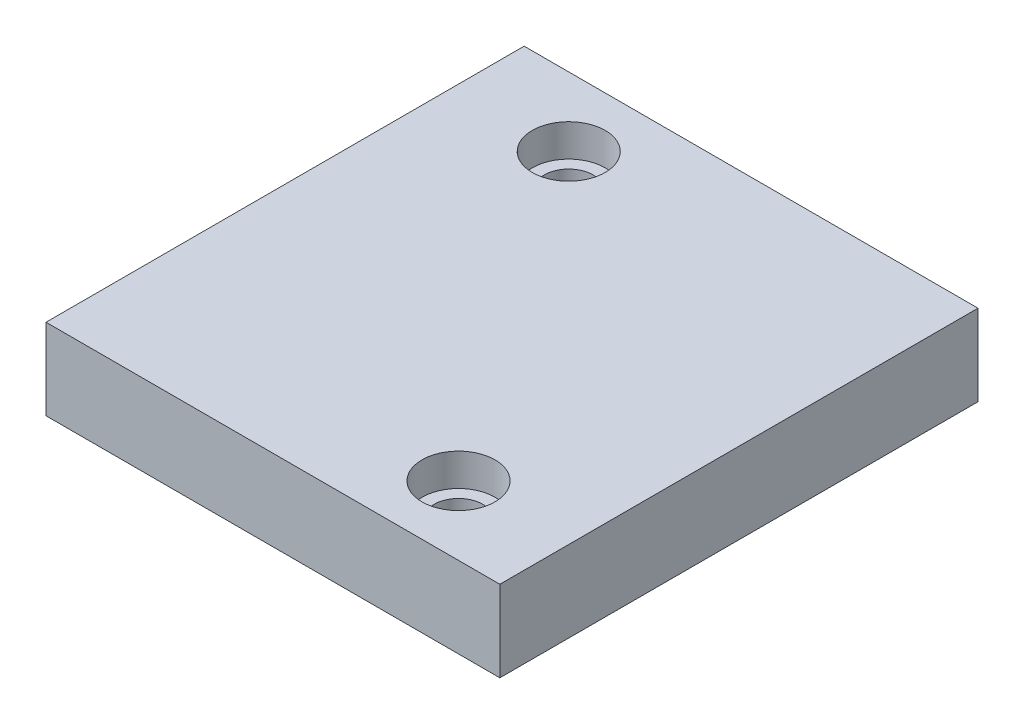
ISO-10303-21;
HEADER;
FILE_DESCRIPTION(('STEP AP214'),'2;1');
FILE_NAME('part.step','',(''),(''),'','','');
FILE_SCHEMA(('AUTOMOTIVE_DESIGN { 1 0 10303 214 1 1 1 1 }'));
ENDSEC;
DATA;
#1=APPLICATION_CONTEXT('core data for automotive mechanical design processes');
#2=APPLICATION_PROTOCOL_DEFINITION('international standard','automotive_design',2000,#1);
#3=PRODUCT_CONTEXT('',#1,'mechanical');
#4=PRODUCT('Part','Part','',(#3));
#5=PRODUCT_RELATED_PRODUCT_CATEGORY('part','',(#4));
#6=PRODUCT_DEFINITION_FORMATION('','',#4);
#7=PRODUCT_DEFINITION_CONTEXT('part definition',#1,'design');
#8=PRODUCT_DEFINITION('design','',#6,#7);
#9=PRODUCT_DEFINITION_SHAPE('','',#8);
#10=(LENGTH_UNIT() NAMED_UNIT(*) SI_UNIT(.MILLI.,.METRE.));
#11=(NAMED_UNIT(*) PLANE_ANGLE_UNIT() SI_UNIT($,.RADIAN.));
#12=(NAMED_UNIT(*) SI_UNIT($,.STERADIAN.) SOLID_ANGLE_UNIT());
#13=UNCERTAINTY_MEASURE_WITH_UNIT(LENGTH_MEASURE(1.E-05),#10,'distance_accuracy_value','');
#14=(GEOMETRIC_REPRESENTATION_CONTEXT(3) GLOBAL_UNCERTAINTY_ASSIGNED_CONTEXT((#13)) GLOBAL_UNIT_ASSIGNED_CONTEXT((#10,
#11,#12)) REPRESENTATION_CONTEXT('',''));
#15=CARTESIAN_POINT('',(0.,0.,0.));
#16=DIRECTION('',(0.,0.,1.));
#17=DIRECTION('',(1.,0.,0.));
#18=AXIS2_PLACEMENT_3D('',#15,#16,#17);
#19=CARTESIAN_POINT('',(-6.8,5.,25.25));
#20=DIRECTION('',(0.,-1.,0.));
#21=DIRECTION('',(0.,0.,-1.));
#22=AXIS2_PLACEMENT_3D('',#19,#20,#21);
#23=CYLINDRICAL_SURFACE('',#22,1.5);
#24=CARTESIAN_POINT('',(-6.8,0.,25.25));
#25=DIRECTION('',(0.,1.,0.));
#26=DIRECTION('',(0.,0.,1.));
#27=AXIS2_PLACEMENT_3D('',#24,#25,#26);
#28=CIRCLE('',#27,1.5);
#29=CARTESIAN_POINT('',(-6.8,0.,26.75));
#30=VERTEX_POINT('',#29);
#31=EDGE_CURVE('E120',#30,#30,#28,.T.);
#32=ORIENTED_EDGE('',*,*,#31,.F.);
#33=EDGE_LOOP('',(#32));
#34=FACE_BOUND('',#33,.T.);
#35=CARTESIAN_POINT('',(-6.8,3.,25.25));
#36=DIRECTION('',(0.,1.,0.));
#37=DIRECTION('',(0.,0.,1.));
#38=AXIS2_PLACEMENT_3D('',#35,#36,#37);
#39=CIRCLE('',#38,1.5);
#40=CARTESIAN_POINT('',(-6.8,3.,26.75));
#41=VERTEX_POINT('',#40);
#42=EDGE_CURVE('E41',#41,#41,#39,.T.);
#43=ORIENTED_EDGE('',*,*,#42,.T.);
#44=EDGE_LOOP('',(#43));
#45=FACE_BOUND('',#44,.T.);
#46=ADVANCED_FACE('F37',(#34,#45),#23,.F.);
#47=CARTESIAN_POINT('',(-21.,5.,4.24999999999998));
#48=DIRECTION('',(0.,-1.,0.));
#49=DIRECTION('',(0.,0.,-1.));
#50=AXIS2_PLACEMENT_3D('',#47,#48,#49);
#51=CYLINDRICAL_SURFACE('',#50,1.5);
#52=CARTESIAN_POINT('',(-21.,0.,4.24999999999998));
#53=DIRECTION('',(0.,1.,0.));
#54=DIRECTION('',(0.,0.,1.));
#55=AXIS2_PLACEMENT_3D('',#52,#53,#54);
#56=CIRCLE('',#55,1.5);
#57=CARTESIAN_POINT('',(-21.,0.,5.74999999999997));
#58=VERTEX_POINT('',#57);
#59=EDGE_CURVE('E106',#58,#58,#56,.T.);
#60=ORIENTED_EDGE('',*,*,#59,.F.);
#61=EDGE_LOOP('',(#60));
#62=FACE_BOUND('',#61,.T.);
#63=CARTESIAN_POINT('',(-21.,3.,4.24999999999998));
#64=DIRECTION('',(0.,1.,0.));
#65=DIRECTION('',(0.,0.,1.));
#66=AXIS2_PLACEMENT_3D('',#63,#64,#65);
#67=CIRCLE('',#66,1.5);
#68=CARTESIAN_POINT('',(-21.,3.,5.74999999999997));
#69=VERTEX_POINT('',#68);
#70=EDGE_CURVE('E114',#69,#69,#67,.T.);
#71=ORIENTED_EDGE('',*,*,#70,.T.);
#72=EDGE_LOOP('',(#71));
#73=FACE_BOUND('',#72,.T.);
#74=ADVANCED_FACE('F149',(#62,#73),#51,.F.);
#75=CARTESIAN_POINT('',(-28.,5.,29.5));
#76=DIRECTION('',(0.,0.,-1.));
#77=DIRECTION('',(-1.,0.,0.));
#78=AXIS2_PLACEMENT_3D('',#75,#76,#77);
#79=PLANE('',#78);
#80=DIRECTION('',(1.,0.,0.));
#81=VECTOR('',#80,1.);
#82=CARTESIAN_POINT('',(-28.,0.,29.5));
#83=LINE('',#82,#81);
#84=CARTESIAN_POINT('',(-28.,0.,29.5));
#85=VERTEX_POINT('',#84);
#86=CARTESIAN_POINT('',(0.,0.,29.5));
#87=VERTEX_POINT('',#86);
#88=EDGE_CURVE('E104',#85,#87,#83,.T.);
#89=ORIENTED_EDGE('',*,*,#88,.T.);
#90=DIRECTION('',(0.,-1.,0.));
#91=VECTOR('',#90,1.);
#92=CARTESIAN_POINT('',(0.,5.,29.5));
#93=LINE('',#92,#91);
#94=CARTESIAN_POINT('',(0.,5.,29.5));
#95=VERTEX_POINT('',#94);
#96=EDGE_CURVE('E11',#95,#87,#93,.T.);
#97=ORIENTED_EDGE('',*,*,#96,.F.);
#98=DIRECTION('',(1.,0.,0.));
#99=VECTOR('',#98,1.);
#100=CARTESIAN_POINT('',(-28.,5.,29.5));
#101=LINE('',#100,#99);
#102=CARTESIAN_POINT('',(-28.,5.,29.5));
#103=VERTEX_POINT('',#102);
#104=EDGE_CURVE('E89',#103,#95,#101,.T.);
#105=ORIENTED_EDGE('',*,*,#104,.F.);
#106=DIRECTION('',(0.,-1.,0.));
#107=VECTOR('',#106,1.);
#108=CARTESIAN_POINT('',(-28.,5.,29.5));
#109=LINE('',#108,#107);
#110=EDGE_CURVE('E56',#103,#85,#109,.T.);
#111=ORIENTED_EDGE('',*,*,#110,.T.);
#112=EDGE_LOOP('',(#89,#97,#105,#111));
#113=FACE_BOUND('',#112,.T.);
#114=ADVANCED_FACE('F39',(#113),#79,.F.);
#115=CARTESIAN_POINT('',(0.,5.,29.5));
#116=DIRECTION('',(-1.,0.,0.));
#117=DIRECTION('',(0.,0.,1.));
#118=AXIS2_PLACEMENT_3D('',#115,#116,#117);
#119=PLANE('',#118);
#120=DIRECTION('',(0.,0.,-1.));
#121=VECTOR('',#120,1.);
#122=CARTESIAN_POINT('',(0.,0.,29.5));
#123=LINE('',#122,#121);
#124=CARTESIAN_POINT('',(0.,0.,0.));
#125=VERTEX_POINT('',#124);
#126=EDGE_CURVE('E94',#87,#125,#123,.T.);
#127=ORIENTED_EDGE('',*,*,#126,.T.);
#128=DIRECTION('',(0.,-1.,0.));
#129=VECTOR('',#128,1.);
#130=CARTESIAN_POINT('',(0.,5.,0.));
#131=LINE('',#130,#129);
#132=CARTESIAN_POINT('',(0.,5.,0.));
#133=VERTEX_POINT('',#132);
#134=EDGE_CURVE('E47',#133,#125,#131,.T.);
#135=ORIENTED_EDGE('',*,*,#134,.F.);
#136=DIRECTION('',(0.,0.,-1.));
#137=VECTOR('',#136,1.);
#138=CARTESIAN_POINT('',(0.,5.,29.5));
#139=LINE('',#138,#137);
#140=EDGE_CURVE('E81',#95,#133,#139,.T.);
#141=ORIENTED_EDGE('',*,*,#140,.F.);
#142=ORIENTED_EDGE('',*,*,#96,.T.);
#143=EDGE_LOOP('',(#127,#135,#141,#142));
#144=FACE_BOUND('',#143,.T.);
#145=ADVANCED_FACE('F93',(#144),#119,.F.);
#146=CARTESIAN_POINT('',(-28.,5.,0.));
#147=DIRECTION('',(0.,0.,-1.));
#148=DIRECTION('',(-1.,0.,0.));
#149=AXIS2_PLACEMENT_3D('',#146,#147,#148);
#150=PLANE('',#149);
#151=DIRECTION('',(1.,0.,0.));
#152=VECTOR('',#151,1.);
#153=CARTESIAN_POINT('',(-28.,0.,0.));
#154=LINE('',#153,#152);
#155=CARTESIAN_POINT('',(-28.,0.,0.));
#156=VERTEX_POINT('',#155);
#157=EDGE_CURVE('E108',#156,#125,#154,.T.);
#158=ORIENTED_EDGE('',*,*,#157,.F.);
#159=DIRECTION('',(0.,-1.,0.));
#160=VECTOR('',#159,1.);
#161=CARTESIAN_POINT('',(-28.,5.,0.));
#162=LINE('',#161,#160);
#163=CARTESIAN_POINT('',(-28.,5.,0.));
#164=VERTEX_POINT('',#163);
#165=EDGE_CURVE('E70',#164,#156,#162,.T.);
#166=ORIENTED_EDGE('',*,*,#165,.F.);
#167=DIRECTION('',(1.,0.,0.));
#168=VECTOR('',#167,1.);
#169=CARTESIAN_POINT('',(-28.,5.,0.));
#170=LINE('',#169,#168);
#171=EDGE_CURVE('E88',#164,#133,#170,.T.);
#172=ORIENTED_EDGE('',*,*,#171,.T.);
#173=ORIENTED_EDGE('',*,*,#134,.T.);
#174=EDGE_LOOP('',(#158,#166,#172,#173));
#175=FACE_BOUND('',#174,.T.);
#176=ADVANCED_FACE('F98',(#175),#150,.T.);
#177=CARTESIAN_POINT('',(-28.,5.,29.5));
#178=DIRECTION('',(-1.,0.,0.));
#179=DIRECTION('',(0.,0.,1.));
#180=AXIS2_PLACEMENT_3D('',#177,#178,#179);
#181=PLANE('',#180);
#182=CARTESIAN_POINT('',(-28.,2.5,10.));
#183=DIRECTION('',(-1.,0.,0.));
#184=DIRECTION('',(0.,0.,1.));
#185=AXIS2_PLACEMENT_3D('',#182,#183,#184);
#186=CIRCLE('',#185,1.);
#187=CARTESIAN_POINT('',(-28.,2.5,11.));
#188=VERTEX_POINT('',#187);
#189=EDGE_CURVE('E220',#188,#188,#186,.T.);
#190=ORIENTED_EDGE('',*,*,#189,.F.);
#191=EDGE_LOOP('',(#190));
#192=FACE_BOUND('',#191,.T.);
#193=CARTESIAN_POINT('',(-28.,2.5,24.5));
#194=DIRECTION('',(-1.,0.,0.));
#195=DIRECTION('',(0.,0.,1.));
#196=AXIS2_PLACEMENT_3D('',#193,#194,#195);
#197=CIRCLE('',#196,1.);
#198=CARTESIAN_POINT('',(-28.,2.5,25.5));
#199=VERTEX_POINT('',#198);
#200=EDGE_CURVE('E130',#199,#199,#197,.T.);
#201=ORIENTED_EDGE('',*,*,#200,.F.);
#202=EDGE_LOOP('',(#201));
#203=FACE_BOUND('',#202,.T.);
#204=DIRECTION('',(0.,0.,-1.));
#205=VECTOR('',#204,1.);
#206=CARTESIAN_POINT('',(-28.,0.,29.5));
#207=LINE('',#206,#205);
#208=EDGE_CURVE('E110',#85,#156,#207,.T.);
#209=ORIENTED_EDGE('',*,*,#208,.F.);
#210=ORIENTED_EDGE('',*,*,#110,.F.);
#211=DIRECTION('',(0.,0.,-1.));
#212=VECTOR('',#211,1.);
#213=CARTESIAN_POINT('',(-28.,5.,29.5));
#214=LINE('',#213,#212);
#215=EDGE_CURVE('E99',#103,#164,#214,.T.);
#216=ORIENTED_EDGE('',*,*,#215,.T.);
#217=ORIENTED_EDGE('',*,*,#165,.T.);
#218=EDGE_LOOP('',(#209,#210,#216,#217));
#219=FACE_BOUND('',#218,.T.);
#220=ADVANCED_FACE('F168',(#192,#203,#219),#181,.T.);
#221=CARTESIAN_POINT('',(0.,5.,0.));
#222=DIRECTION('',(0.,1.,0.));
#223=DIRECTION('',(0.,0.,1.));
#224=AXIS2_PLACEMENT_3D('',#221,#222,#223);
#225=PLANE('',#224);
#226=CARTESIAN_POINT('',(-21.,5.,4.24999999999998));
#227=DIRECTION('',(0.,1.,0.));
#228=DIRECTION('',(0.,0.,1.));
#229=AXIS2_PLACEMENT_3D('',#226,#227,#228);
#230=CIRCLE('',#229,2.25);
#231=CARTESIAN_POINT('',(-21.,5.,6.49999999999997));
#232=VERTEX_POINT('',#231);
#233=EDGE_CURVE('E122',#232,#232,#230,.T.);
#234=ORIENTED_EDGE('',*,*,#233,.F.);
#235=EDGE_LOOP('',(#234));
#236=FACE_BOUND('',#235,.T.);
#237=CARTESIAN_POINT('',(-6.8,5.,25.25));
#238=DIRECTION('',(0.,1.,0.));
#239=DIRECTION('',(0.,0.,1.));
#240=AXIS2_PLACEMENT_3D('',#237,#238,#239);
#241=CIRCLE('',#240,2.25);
#242=CARTESIAN_POINT('',(-6.8,5.,27.5));
#243=VERTEX_POINT('',#242);
#244=EDGE_CURVE('E127',#243,#243,#241,.T.);
#245=ORIENTED_EDGE('',*,*,#244,.F.);
#246=EDGE_LOOP('',(#245));
#247=FACE_BOUND('',#246,.T.);
#248=ORIENTED_EDGE('',*,*,#104,.T.);
#249=ORIENTED_EDGE('',*,*,#140,.T.);
#250=ORIENTED_EDGE('',*,*,#171,.F.);
#251=ORIENTED_EDGE('',*,*,#215,.F.);
#252=EDGE_LOOP('',(#248,#249,#250,#251));
#253=FACE_BOUND('',#252,.T.);
#254=ADVANCED_FACE('F85',(#236,#247,#253),#225,.T.);
#255=CARTESIAN_POINT('',(0.,0.,0.));
#256=DIRECTION('',(0.,1.,0.));
#257=DIRECTION('',(0.,0.,1.));
#258=AXIS2_PLACEMENT_3D('',#255,#256,#257);
#259=PLANE('',#258);
#260=ORIENTED_EDGE('',*,*,#59,.T.);
#261=EDGE_LOOP('',(#260));
#262=FACE_BOUND('',#261,.T.);
#263=ORIENTED_EDGE('',*,*,#31,.T.);
#264=EDGE_LOOP('',(#263));
#265=FACE_BOUND('',#264,.T.);
#266=ORIENTED_EDGE('',*,*,#88,.F.);
#267=ORIENTED_EDGE('',*,*,#208,.T.);
#268=ORIENTED_EDGE('',*,*,#157,.T.);
#269=ORIENTED_EDGE('',*,*,#126,.F.);
#270=EDGE_LOOP('',(#266,#267,#268,#269));
#271=FACE_BOUND('',#270,.T.);
#272=ADVANCED_FACE('F144',(#262,#265,#271),#259,.F.);
#273=CARTESIAN_POINT('',(-21.,3.,4.24999999999998));
#274=DIRECTION('',(0.,1.,0.));
#275=DIRECTION('',(0.,0.,1.));
#276=AXIS2_PLACEMENT_3D('',#273,#274,#275);
#277=CYLINDRICAL_SURFACE('',#276,2.25);
#278=CARTESIAN_POINT('',(-21.,3.,4.24999999999998));
#279=DIRECTION('',(0.,1.,0.));
#280=DIRECTION('',(0.,0.,1.));
#281=AXIS2_PLACEMENT_3D('',#278,#279,#280);
#282=CIRCLE('',#281,2.25);
#283=CARTESIAN_POINT('',(-21.,3.,6.49999999999997));
#284=VERTEX_POINT('',#283);
#285=EDGE_CURVE('E116',#284,#284,#282,.T.);
#286=ORIENTED_EDGE('',*,*,#285,.F.);
#287=EDGE_LOOP('',(#286));
#288=FACE_BOUND('',#287,.T.);
#289=ORIENTED_EDGE('',*,*,#233,.T.);
#290=EDGE_LOOP('',(#289));
#291=FACE_BOUND('',#290,.T.);
#292=ADVANCED_FACE('F175',(#288,#291),#277,.F.);
#293=CARTESIAN_POINT('',(-21.,3.,4.24999999999998));
#294=DIRECTION('',(0.,1.,0.));
#295=DIRECTION('',(0.,0.,1.));
#296=AXIS2_PLACEMENT_3D('',#293,#294,#295);
#297=PLANE('',#296);
#298=ORIENTED_EDGE('',*,*,#70,.F.);
#299=EDGE_LOOP('',(#298));
#300=FACE_BOUND('',#299,.T.);
#301=ORIENTED_EDGE('',*,*,#285,.T.);
#302=EDGE_LOOP('',(#301));
#303=FACE_BOUND('',#302,.T.);
#304=ADVANCED_FACE('F163',(#300,#303),#297,.T.);
#305=CARTESIAN_POINT('',(-6.8,3.,25.25));
#306=DIRECTION('',(0.,1.,0.));
#307=DIRECTION('',(0.,0.,1.));
#308=AXIS2_PLACEMENT_3D('',#305,#306,#307);
#309=CYLINDRICAL_SURFACE('',#308,2.25);
#310=CARTESIAN_POINT('',(-6.8,3.,25.25));
#311=DIRECTION('',(0.,1.,0.));
#312=DIRECTION('',(0.,0.,1.));
#313=AXIS2_PLACEMENT_3D('',#310,#311,#312);
#314=CIRCLE('',#313,2.25);
#315=CARTESIAN_POINT('',(-6.8,3.,27.5));
#316=VERTEX_POINT('',#315);
#317=EDGE_CURVE('E135',#316,#316,#314,.T.);
#318=ORIENTED_EDGE('',*,*,#317,.F.);
#319=EDGE_LOOP('',(#318));
#320=FACE_BOUND('',#319,.T.);
#321=ORIENTED_EDGE('',*,*,#244,.T.);
#322=EDGE_LOOP('',(#321));
#323=FACE_BOUND('',#322,.T.);
#324=ADVANCED_FACE('F157',(#320,#323),#309,.F.);
#325=CARTESIAN_POINT('',(-6.8,3.,25.25));
#326=DIRECTION('',(0.,1.,0.));
#327=DIRECTION('',(0.,0.,1.));
#328=AXIS2_PLACEMENT_3D('',#325,#326,#327);
#329=PLANE('',#328);
#330=ORIENTED_EDGE('',*,*,#42,.F.);
#331=EDGE_LOOP('',(#330));
#332=FACE_BOUND('',#331,.T.);
#333=ORIENTED_EDGE('',*,*,#317,.T.);
#334=EDGE_LOOP('',(#333));
#335=FACE_BOUND('',#334,.T.);
#336=ADVANCED_FACE('F153',(#332,#335),#329,.T.);
#337=CARTESIAN_POINT('',(-24.,2.5,24.5));
#338=DIRECTION('',(-1.,0.,0.));
#339=DIRECTION('',(0.,0.,1.));
#340=AXIS2_PLACEMENT_3D('',#337,#338,#339);
#341=CYLINDRICAL_SURFACE('',#340,1.);
#342=CARTESIAN_POINT('',(-24.,2.5,24.5));
#343=DIRECTION('',(-1.,0.,0.));
#344=DIRECTION('',(0.,0.,1.));
#345=AXIS2_PLACEMENT_3D('',#342,#343,#344);
#346=CIRCLE('',#345,1.);
#347=CARTESIAN_POINT('',(-24.,2.5,25.5));
#348=VERTEX_POINT('',#347);
#349=EDGE_CURVE('E223',#348,#348,#346,.T.);
#350=ORIENTED_EDGE('',*,*,#349,.F.);
#351=EDGE_LOOP('',(#350));
#352=FACE_BOUND('',#351,.T.);
#353=ORIENTED_EDGE('',*,*,#200,.T.);
#354=EDGE_LOOP('',(#353));
#355=FACE_BOUND('',#354,.T.);
#356=ADVANCED_FACE('F156',(#352,#355),#341,.F.);
#357=CARTESIAN_POINT('',(-24.,2.5,24.5));
#358=DIRECTION('',(-1.,0.,0.));
#359=DIRECTION('',(0.,0.,1.));
#360=AXIS2_PLACEMENT_3D('',#357,#358,#359);
#361=PLANE('',#360);
#362=ORIENTED_EDGE('',*,*,#349,.T.);
#363=EDGE_LOOP('',(#362));
#364=FACE_BOUND('',#363,.T.);
#365=ADVANCED_FACE('F204',(#364),#361,.T.);
#366=CARTESIAN_POINT('',(-24.,2.5,10.));
#367=DIRECTION('',(-1.,0.,0.));
#368=DIRECTION('',(0.,0.,1.));
#369=AXIS2_PLACEMENT_3D('',#366,#367,#368);
#370=CYLINDRICAL_SURFACE('',#369,1.);
#371=CARTESIAN_POINT('',(-24.,2.5,10.));
#372=DIRECTION('',(-1.,0.,0.));
#373=DIRECTION('',(0.,0.,1.));
#374=AXIS2_PLACEMENT_3D('',#371,#372,#373);
#375=CIRCLE('',#374,1.);
#376=CARTESIAN_POINT('',(-24.,2.5,11.));
#377=VERTEX_POINT('',#376);
#378=EDGE_CURVE('E138',#377,#377,#375,.T.);
#379=ORIENTED_EDGE('',*,*,#378,.F.);
#380=EDGE_LOOP('',(#379));
#381=FACE_BOUND('',#380,.T.);
#382=ORIENTED_EDGE('',*,*,#189,.T.);
#383=EDGE_LOOP('',(#382));
#384=FACE_BOUND('',#383,.T.);
#385=ADVANCED_FACE('F208',(#381,#384),#370,.F.);
#386=CARTESIAN_POINT('',(-24.,2.5,10.));
#387=DIRECTION('',(-1.,0.,0.));
#388=DIRECTION('',(0.,0.,1.));
#389=AXIS2_PLACEMENT_3D('',#386,#387,#388);
#390=PLANE('',#389);
#391=ORIENTED_EDGE('',*,*,#378,.T.);
#392=EDGE_LOOP('',(#391));
#393=FACE_BOUND('',#392,.T.);
#394=ADVANCED_FACE('F212',(#393),#390,.T.);
#395=CLOSED_SHELL('',(#46,#74,#114,#145,#176,#220,#254,#272,#292,#304,#324,#336,#356,#365,#385,#394));
#396=MANIFOLD_SOLID_BREP('B2',#395);
#397=ADVANCED_BREP_SHAPE_REPRESENTATION('',(#18,#396),#14);
#398=SHAPE_DEFINITION_REPRESENTATION(#9,#397);
ENDSEC;
END-ISO-10303-21;
